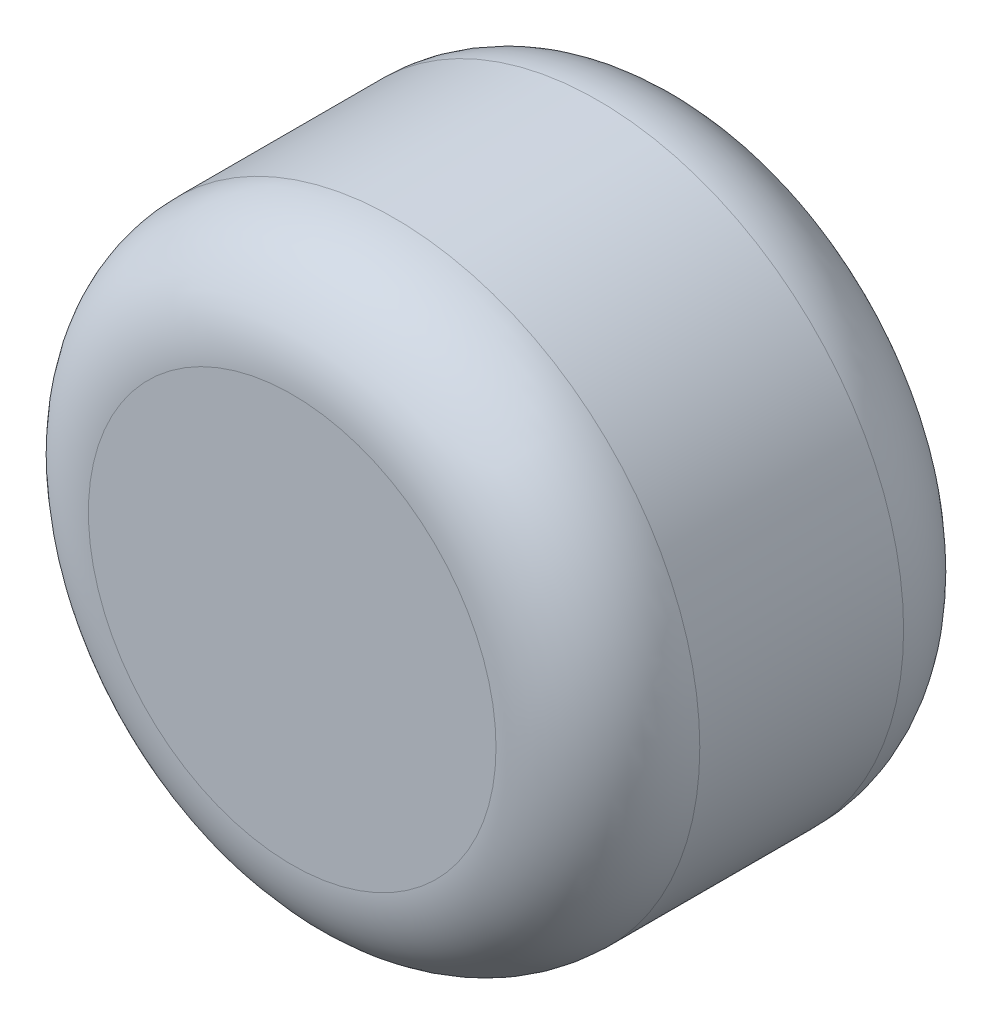
ISO-10303-21;
HEADER;
FILE_DESCRIPTION(('STEP AP214'),'2;1');
FILE_NAME('part.step','',(''),(''),'','','');
FILE_SCHEMA(('AUTOMOTIVE_DESIGN { 1 0 10303 214 1 1 1 1 }'));
ENDSEC;
DATA;
#1=APPLICATION_CONTEXT('core data for automotive mechanical design processes');
#2=APPLICATION_PROTOCOL_DEFINITION('international standard','automotive_design',2000,#1);
#3=PRODUCT_CONTEXT('',#1,'mechanical');
#4=PRODUCT('Part','Part','',(#3));
#5=PRODUCT_RELATED_PRODUCT_CATEGORY('part','',(#4));
#6=PRODUCT_DEFINITION_FORMATION('','',#4);
#7=PRODUCT_DEFINITION_CONTEXT('part definition',#1,'design');
#8=PRODUCT_DEFINITION('design','',#6,#7);
#9=PRODUCT_DEFINITION_SHAPE('','',#8);
#10=(LENGTH_UNIT() NAMED_UNIT(*) SI_UNIT(.MILLI.,.METRE.));
#11=(NAMED_UNIT(*) PLANE_ANGLE_UNIT() SI_UNIT($,.RADIAN.));
#12=(NAMED_UNIT(*) SI_UNIT($,.STERADIAN.) SOLID_ANGLE_UNIT());
#13=UNCERTAINTY_MEASURE_WITH_UNIT(LENGTH_MEASURE(1.E-05),#10,'distance_accuracy_value','');
#14=(GEOMETRIC_REPRESENTATION_CONTEXT(3) GLOBAL_UNCERTAINTY_ASSIGNED_CONTEXT((#13)) GLOBAL_UNIT_ASSIGNED_CONTEXT((#10,
#11,#12)) REPRESENTATION_CONTEXT('',''));
#15=CARTESIAN_POINT('',(0.,0.,0.));
#16=DIRECTION('',(0.,0.,1.));
#17=DIRECTION('',(1.,0.,0.));
#18=AXIS2_PLACEMENT_3D('',#15,#16,#17);
#19=CARTESIAN_POINT('',(0.,0.,101.6));
#20=DIRECTION('',(0.,0.,-1.));
#21=DIRECTION('',(-1.,0.,0.));
#22=AXIS2_PLACEMENT_3D('',#19,#20,#21);
#23=CYLINDRICAL_SURFACE('',#22,76.2);
#24=CARTESIAN_POINT('',(0.,0.,25.4));
#25=DIRECTION('',(0.,0.,1.));
#26=DIRECTION('',(1.,0.,0.));
#27=AXIS2_PLACEMENT_3D('',#24,#25,#26);
#28=CIRCLE('',#27,76.2);
#29=CARTESIAN_POINT('',(76.2,0.,25.4));
#30=VERTEX_POINT('',#29);
#31=EDGE_CURVE('E42',#30,#30,#28,.T.);
#32=ORIENTED_EDGE('',*,*,#31,.T.);
#33=EDGE_LOOP('',(#32));
#34=FACE_BOUND('',#33,.T.);
#35=CARTESIAN_POINT('',(0.,0.,76.2));
#36=DIRECTION('',(0.,0.,1.));
#37=DIRECTION('',(1.,0.,0.));
#38=AXIS2_PLACEMENT_3D('',#35,#36,#37);
#39=CIRCLE('',#38,76.2);
#40=CARTESIAN_POINT('',(76.2,0.,76.2));
#41=VERTEX_POINT('',#40);
#42=EDGE_CURVE('E46',#41,#41,#39,.F.);
#43=ORIENTED_EDGE('',*,*,#42,.T.);
#44=EDGE_LOOP('',(#43));
#45=FACE_BOUND('',#44,.T.);
#46=ADVANCED_FACE('F31',(#34,#45),#23,.T.);
#47=CARTESIAN_POINT('',(0.,0.,101.6));
#48=DIRECTION('',(0.,0.,1.));
#49=DIRECTION('',(1.,0.,0.));
#50=AXIS2_PLACEMENT_3D('',#47,#48,#49);
#51=PLANE('',#50);
#52=CARTESIAN_POINT('',(0.,0.,101.6));
#53=DIRECTION('',(0.,0.,1.));
#54=DIRECTION('',(1.,0.,0.));
#55=AXIS2_PLACEMENT_3D('',#52,#53,#54);
#56=CIRCLE('',#55,50.8);
#57=CARTESIAN_POINT('',(50.8,0.,101.6));
#58=VERTEX_POINT('',#57);
#59=EDGE_CURVE('E10',#58,#58,#56,.T.);
#60=ORIENTED_EDGE('',*,*,#59,.T.);
#61=EDGE_LOOP('',(#60));
#62=FACE_BOUND('',#61,.T.);
#63=ADVANCED_FACE('F62',(#62),#51,.T.);
#64=CARTESIAN_POINT('',(0.,0.,0.));
#65=DIRECTION('',(0.,0.,1.));
#66=DIRECTION('',(1.,0.,0.));
#67=AXIS2_PLACEMENT_3D('',#64,#65,#66);
#68=PLANE('',#67);
#69=CARTESIAN_POINT('',(0.,0.,0.));
#70=DIRECTION('',(0.,0.,1.));
#71=DIRECTION('',(1.,0.,0.));
#72=AXIS2_PLACEMENT_3D('',#69,#70,#71);
#73=CIRCLE('',#72,50.8);
#74=CARTESIAN_POINT('',(50.8,0.,0.));
#75=VERTEX_POINT('',#74);
#76=EDGE_CURVE('E38',#75,#75,#73,.F.);
#77=ORIENTED_EDGE('',*,*,#76,.T.);
#78=EDGE_LOOP('',(#77));
#79=FACE_BOUND('',#78,.T.);
#80=ADVANCED_FACE('F59',(#79),#68,.F.);
#81=CARTESIAN_POINT('',(0.,0.,25.4));
#82=DIRECTION('',(0.,0.,1.));
#83=DIRECTION('',(1.,0.,0.));
#84=AXIS2_PLACEMENT_3D('',#81,#82,#83);
#85=TOROIDAL_SURFACE('',#84,50.8,25.4);
#86=ORIENTED_EDGE('',*,*,#76,.F.);
#87=EDGE_LOOP('',(#86));
#88=FACE_BOUND('',#87,.T.);
#89=ORIENTED_EDGE('',*,*,#31,.F.);
#90=EDGE_LOOP('',(#89));
#91=FACE_BOUND('',#90,.T.);
#92=ADVANCED_FACE('F55',(#88,#91),#85,.T.);
#93=CARTESIAN_POINT('',(0.,0.,76.2));
#94=DIRECTION('',(0.,0.,1.));
#95=DIRECTION('',(1.,0.,0.));
#96=AXIS2_PLACEMENT_3D('',#93,#94,#95);
#97=TOROIDAL_SURFACE('',#96,50.8,25.4);
#98=ORIENTED_EDGE('',*,*,#42,.F.);
#99=EDGE_LOOP('',(#98));
#100=FACE_BOUND('',#99,.T.);
#101=ORIENTED_EDGE('',*,*,#59,.F.);
#102=EDGE_LOOP('',(#101));
#103=FACE_BOUND('',#102,.T.);
#104=ADVANCED_FACE('F33',(#100,#103),#97,.T.);
#105=CLOSED_SHELL('',(#46,#63,#80,#92,#104));
#106=MANIFOLD_SOLID_BREP('B2',#105);
#107=ADVANCED_BREP_SHAPE_REPRESENTATION('',(#18,#106),#14);
#108=SHAPE_DEFINITION_REPRESENTATION(#9,#107);
ENDSEC;
END-ISO-10303-21;
